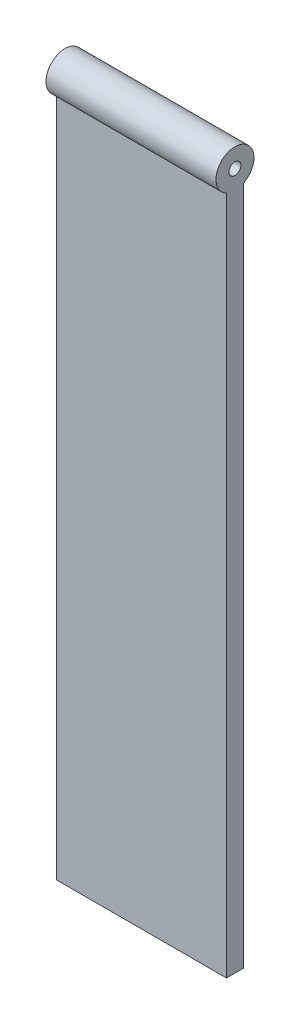
ISO-10303-21;
HEADER;
FILE_DESCRIPTION(('STEP AP214'),'2;1');
FILE_NAME('part.step','',(''),(''),'','','');
FILE_SCHEMA(('AUTOMOTIVE_DESIGN { 1 0 10303 214 1 1 1 1 }'));
ENDSEC;
DATA;
#1=APPLICATION_CONTEXT('core data for automotive mechanical design processes');
#2=APPLICATION_PROTOCOL_DEFINITION('international standard','automotive_design',2000,#1);
#3=PRODUCT_CONTEXT('',#1,'mechanical');
#4=PRODUCT('Part','Part','',(#3));
#5=PRODUCT_RELATED_PRODUCT_CATEGORY('part','',(#4));
#6=PRODUCT_DEFINITION_FORMATION('','',#4);
#7=PRODUCT_DEFINITION_CONTEXT('part definition',#1,'design');
#8=PRODUCT_DEFINITION('design','',#6,#7);
#9=PRODUCT_DEFINITION_SHAPE('','',#8);
#10=(LENGTH_UNIT() NAMED_UNIT(*) SI_UNIT(.MILLI.,.METRE.));
#11=(NAMED_UNIT(*) PLANE_ANGLE_UNIT() SI_UNIT($,.RADIAN.));
#12=(NAMED_UNIT(*) SI_UNIT($,.STERADIAN.) SOLID_ANGLE_UNIT());
#13=UNCERTAINTY_MEASURE_WITH_UNIT(LENGTH_MEASURE(1.E-05),#10,'distance_accuracy_value','');
#14=(GEOMETRIC_REPRESENTATION_CONTEXT(3) GLOBAL_UNCERTAINTY_ASSIGNED_CONTEXT((#13)) GLOBAL_UNIT_ASSIGNED_CONTEXT((#10,
#11,#12)) REPRESENTATION_CONTEXT('',''));
#15=CARTESIAN_POINT('',(0.,0.,0.));
#16=DIRECTION('',(0.,0.,1.));
#17=DIRECTION('',(1.,0.,0.));
#18=AXIS2_PLACEMENT_3D('',#15,#16,#17);
#19=CARTESIAN_POINT('',(20.,82.,-1.));
#20=DIRECTION('',(1.,0.,0.));
#21=DIRECTION('',(0.,0.,-1.));
#22=AXIS2_PLACEMENT_3D('',#19,#20,#21);
#23=PLANE('',#22);
#24=DIRECTION('',(0.,-1.,0.));
#25=VECTOR('',#24,1.);
#26=CARTESIAN_POINT('',(20.,0.,0.));
#27=LINE('',#26,#25);
#28=CARTESIAN_POINT('',(20.,80.,0.));
#29=VERTEX_POINT('',#28);
#30=CARTESIAN_POINT('',(20.,0.,0.));
#31=VERTEX_POINT('',#30);
#32=EDGE_CURVE('E92',#29,#31,#27,.T.);
#33=ORIENTED_EDGE('',*,*,#32,.T.);
#34=DIRECTION('',(0.,0.,-1.));
#35=VECTOR('',#34,1.);
#36=CARTESIAN_POINT('',(20.,0.,0.));
#37=LINE('',#36,#35);
#38=CARTESIAN_POINT('',(20.,0.,-2.));
#39=VERTEX_POINT('',#38);
#40=EDGE_CURVE('E87',#31,#39,#37,.T.);
#41=ORIENTED_EDGE('',*,*,#40,.T.);
#42=DIRECTION('',(0.,1.,0.));
#43=VECTOR('',#42,1.);
#44=CARTESIAN_POINT('',(20.,0.,-2.));
#45=LINE('',#44,#43);
#46=CARTESIAN_POINT('',(20.,80.,-2.));
#47=VERTEX_POINT('',#46);
#48=EDGE_CURVE('E90',#39,#47,#45,.T.);
#49=ORIENTED_EDGE('',*,*,#48,.T.);
#50=CARTESIAN_POINT('',(20.,82.,-1.));
#51=DIRECTION('',(1.,0.,0.));
#52=DIRECTION('',(0.,0.,-1.));
#53=AXIS2_PLACEMENT_3D('',#50,#51,#52);
#54=CIRCLE('',#53,2.23606797749979);
#55=EDGE_CURVE('E57',#47,#29,#54,.T.);
#56=ORIENTED_EDGE('',*,*,#55,.T.);
#57=EDGE_LOOP('',(#33,#41,#49,#56));
#58=FACE_BOUND('',#57,.T.);
#59=CARTESIAN_POINT('',(20.,82.,-1.));
#60=DIRECTION('',(1.,0.,0.));
#61=DIRECTION('',(0.,0.,-1.));
#62=AXIS2_PLACEMENT_3D('',#59,#60,#61);
#63=CIRCLE('',#62,0.700000000000002);
#64=CARTESIAN_POINT('',(20.,82.,-1.7));
#65=VERTEX_POINT('',#64);
#66=EDGE_CURVE('E112',#65,#65,#63,.T.);
#67=ORIENTED_EDGE('',*,*,#66,.F.);
#68=EDGE_LOOP('',(#67));
#69=FACE_BOUND('',#68,.T.);
#70=ADVANCED_FACE('F39',(#58,#69),#23,.T.);
#71=CARTESIAN_POINT('',(0.,82.,-1.));
#72=DIRECTION('',(1.,0.,0.));
#73=DIRECTION('',(0.,0.,-1.));
#74=AXIS2_PLACEMENT_3D('',#71,#72,#73);
#75=PLANE('',#74);
#76=DIRECTION('',(0.,-1.,0.));
#77=VECTOR('',#76,1.);
#78=CARTESIAN_POINT('',(0.,0.,0.));
#79=LINE('',#78,#77);
#80=CARTESIAN_POINT('',(0.,80.,0.));
#81=VERTEX_POINT('',#80);
#82=CARTESIAN_POINT('',(0.,0.,0.));
#83=VERTEX_POINT('',#82);
#84=EDGE_CURVE('E108',#81,#83,#79,.T.);
#85=ORIENTED_EDGE('',*,*,#84,.F.);
#86=CARTESIAN_POINT('',(0.,82.,-1.));
#87=DIRECTION('',(1.,0.,0.));
#88=DIRECTION('',(0.,0.,-1.));
#89=AXIS2_PLACEMENT_3D('',#86,#87,#88);
#90=CIRCLE('',#89,2.23606797749979);
#91=CARTESIAN_POINT('',(0.,80.,-2.));
#92=VERTEX_POINT('',#91);
#93=EDGE_CURVE('E80',#92,#81,#90,.T.);
#94=ORIENTED_EDGE('',*,*,#93,.F.);
#95=DIRECTION('',(0.,1.,0.));
#96=VECTOR('',#95,1.);
#97=CARTESIAN_POINT('',(0.,0.,-2.));
#98=LINE('',#97,#96);
#99=CARTESIAN_POINT('',(0.,0.,-2.));
#100=VERTEX_POINT('',#99);
#101=EDGE_CURVE('E74',#100,#92,#98,.T.);
#102=ORIENTED_EDGE('',*,*,#101,.F.);
#103=DIRECTION('',(0.,0.,-1.));
#104=VECTOR('',#103,1.);
#105=CARTESIAN_POINT('',(0.,0.,0.));
#106=LINE('',#105,#104);
#107=EDGE_CURVE('E97',#83,#100,#106,.T.);
#108=ORIENTED_EDGE('',*,*,#107,.F.);
#109=EDGE_LOOP('',(#85,#94,#102,#108));
#110=FACE_BOUND('',#109,.T.);
#111=CARTESIAN_POINT('',(0.,82.,-1.));
#112=DIRECTION('',(1.,0.,0.));
#113=DIRECTION('',(0.,0.,-1.));
#114=AXIS2_PLACEMENT_3D('',#111,#112,#113);
#115=CIRCLE('',#114,0.700000000000002);
#116=CARTESIAN_POINT('',(0.,82.,-1.7));
#117=VERTEX_POINT('',#116);
#118=EDGE_CURVE('E130',#117,#117,#115,.T.);
#119=ORIENTED_EDGE('',*,*,#118,.T.);
#120=EDGE_LOOP('',(#119));
#121=FACE_BOUND('',#120,.T.);
#122=ADVANCED_FACE('F125',(#110,#121),#75,.F.);
#123=CARTESIAN_POINT('',(20.,0.,0.));
#124=DIRECTION('',(0.,0.,-1.));
#125=DIRECTION('',(-1.,0.,0.));
#126=AXIS2_PLACEMENT_3D('',#123,#124,#125);
#127=PLANE('',#126);
#128=ORIENTED_EDGE('',*,*,#84,.T.);
#129=DIRECTION('',(-1.,0.,0.));
#130=VECTOR('',#129,1.);
#131=CARTESIAN_POINT('',(20.,0.,0.));
#132=LINE('',#131,#130);
#133=EDGE_CURVE('E11',#31,#83,#132,.T.);
#134=ORIENTED_EDGE('',*,*,#133,.F.);
#135=ORIENTED_EDGE('',*,*,#32,.F.);
#136=DIRECTION('',(-1.,0.,0.));
#137=VECTOR('',#136,1.);
#138=CARTESIAN_POINT('',(20.,80.,0.));
#139=LINE('',#138,#137);
#140=EDGE_CURVE('E104',#29,#81,#139,.T.);
#141=ORIENTED_EDGE('',*,*,#140,.T.);
#142=EDGE_LOOP('',(#128,#134,#135,#141));
#143=FACE_BOUND('',#142,.T.);
#144=ADVANCED_FACE('F41',(#143),#127,.F.);
#145=CARTESIAN_POINT('',(20.,0.,0.));
#146=DIRECTION('',(0.,1.,0.));
#147=DIRECTION('',(0.,0.,1.));
#148=AXIS2_PLACEMENT_3D('',#145,#146,#147);
#149=PLANE('',#148);
#150=ORIENTED_EDGE('',*,*,#107,.T.);
#151=DIRECTION('',(-1.,0.,0.));
#152=VECTOR('',#151,1.);
#153=CARTESIAN_POINT('',(20.,0.,-2.));
#154=LINE('',#153,#152);
#155=EDGE_CURVE('E49',#39,#100,#154,.T.);
#156=ORIENTED_EDGE('',*,*,#155,.F.);
#157=ORIENTED_EDGE('',*,*,#40,.F.);
#158=ORIENTED_EDGE('',*,*,#133,.T.);
#159=EDGE_LOOP('',(#150,#156,#157,#158));
#160=FACE_BOUND('',#159,.T.);
#161=ADVANCED_FACE('F96',(#160),#149,.F.);
#162=CARTESIAN_POINT('',(20.,0.,-2.));
#163=DIRECTION('',(0.,0.,1.));
#164=DIRECTION('',(1.,0.,0.));
#165=AXIS2_PLACEMENT_3D('',#162,#163,#164);
#166=PLANE('',#165);
#167=ORIENTED_EDGE('',*,*,#101,.T.);
#168=DIRECTION('',(-1.,0.,0.));
#169=VECTOR('',#168,1.);
#170=CARTESIAN_POINT('',(20.,80.,-2.));
#171=LINE('',#170,#169);
#172=EDGE_CURVE('E99',#47,#92,#171,.T.);
#173=ORIENTED_EDGE('',*,*,#172,.F.);
#174=ORIENTED_EDGE('',*,*,#48,.F.);
#175=ORIENTED_EDGE('',*,*,#155,.T.);
#176=EDGE_LOOP('',(#167,#173,#174,#175));
#177=FACE_BOUND('',#176,.T.);
#178=ADVANCED_FACE('F100',(#177),#166,.F.);
#179=CARTESIAN_POINT('',(20.,82.,-1.));
#180=DIRECTION('',(-1.,0.,0.));
#181=DIRECTION('',(0.,0.,1.));
#182=AXIS2_PLACEMENT_3D('',#179,#180,#181);
#183=CYLINDRICAL_SURFACE('',#182,2.23606797749979);
#184=ORIENTED_EDGE('',*,*,#93,.T.);
#185=ORIENTED_EDGE('',*,*,#140,.F.);
#186=ORIENTED_EDGE('',*,*,#55,.F.);
#187=ORIENTED_EDGE('',*,*,#172,.T.);
#188=EDGE_LOOP('',(#184,#185,#186,#187));
#189=FACE_BOUND('',#188,.T.);
#190=ADVANCED_FACE('F122',(#189),#183,.T.);
#191=CARTESIAN_POINT('',(20.,82.,-1.));
#192=DIRECTION('',(-1.,0.,0.));
#193=DIRECTION('',(0.,0.,1.));
#194=AXIS2_PLACEMENT_3D('',#191,#192,#193);
#195=CYLINDRICAL_SURFACE('',#194,0.700000000000002);
#196=ORIENTED_EDGE('',*,*,#66,.T.);
#197=EDGE_LOOP('',(#196));
#198=FACE_BOUND('',#197,.T.);
#199=ORIENTED_EDGE('',*,*,#118,.F.);
#200=EDGE_LOOP('',(#199));
#201=FACE_BOUND('',#200,.T.);
#202=ADVANCED_FACE('F138',(#198,#201),#195,.F.);
#203=CLOSED_SHELL('',(#70,#122,#144,#161,#178,#190,#202));
#204=MANIFOLD_SOLID_BREP('B2',#203);
#205=ADVANCED_BREP_SHAPE_REPRESENTATION('',(#18,#204),#14);
#206=SHAPE_DEFINITION_REPRESENTATION(#9,#205);
ENDSEC;
END-ISO-10303-21;
